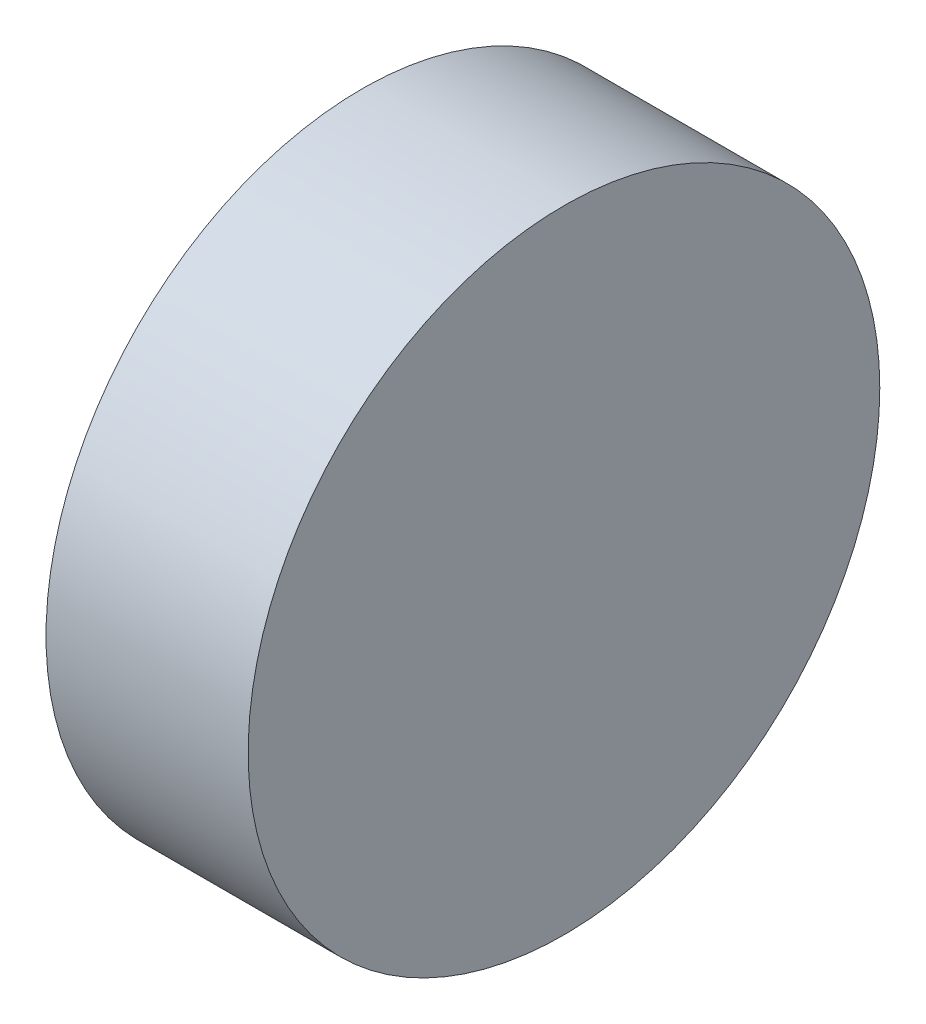
ISO-10303-21;
HEADER;
FILE_DESCRIPTION(('STEP AP214'),'2;1');
FILE_NAME('part.step','',(''),(''),'','','');
FILE_SCHEMA(('AUTOMOTIVE_DESIGN { 1 0 10303 214 1 1 1 1 }'));
ENDSEC;
DATA;
#1=APPLICATION_CONTEXT('core data for automotive mechanical design processes');
#2=APPLICATION_PROTOCOL_DEFINITION('international standard','automotive_design',2000,#1);
#3=PRODUCT_CONTEXT('',#1,'mechanical');
#4=PRODUCT('Part','Part','',(#3));
#5=PRODUCT_RELATED_PRODUCT_CATEGORY('part','',(#4));
#6=PRODUCT_DEFINITION_FORMATION('','',#4);
#7=PRODUCT_DEFINITION_CONTEXT('part definition',#1,'design');
#8=PRODUCT_DEFINITION('design','',#6,#7);
#9=PRODUCT_DEFINITION_SHAPE('','',#8);
#10=(LENGTH_UNIT() NAMED_UNIT(*) SI_UNIT(.MILLI.,.METRE.));
#11=(NAMED_UNIT(*) PLANE_ANGLE_UNIT() SI_UNIT($,.RADIAN.));
#12=(NAMED_UNIT(*) SI_UNIT($,.STERADIAN.) SOLID_ANGLE_UNIT());
#13=UNCERTAINTY_MEASURE_WITH_UNIT(LENGTH_MEASURE(1.E-05),#10,'distance_accuracy_value','');
#14=(GEOMETRIC_REPRESENTATION_CONTEXT(3) GLOBAL_UNCERTAINTY_ASSIGNED_CONTEXT((#13)) GLOBAL_UNIT_ASSIGNED_CONTEXT((#10,
#11,#12)) REPRESENTATION_CONTEXT('',''));
#15=CARTESIAN_POINT('',(0.,0.,0.));
#16=DIRECTION('',(0.,0.,1.));
#17=DIRECTION('',(1.,0.,0.));
#18=AXIS2_PLACEMENT_3D('',#15,#16,#17);
#19=CARTESIAN_POINT('',(203.2,0.,0.));
#20=DIRECTION('',(-1.,0.,0.));
#21=DIRECTION('',(0.,0.,1.));
#22=AXIS2_PLACEMENT_3D('',#19,#20,#21);
#23=CYLINDRICAL_SURFACE('',#22,317.5);
#24=CARTESIAN_POINT('',(203.2,0.,0.));
#25=DIRECTION('',(1.,0.,0.));
#26=DIRECTION('',(0.,0.,-1.));
#27=AXIS2_PLACEMENT_3D('',#24,#25,#26);
#28=CIRCLE('',#27,317.5);
#29=CARTESIAN_POINT('',(203.2,0.,-317.5));
#30=VERTEX_POINT('',#29);
#31=EDGE_CURVE('E10',#30,#30,#28,.T.);
#32=ORIENTED_EDGE('',*,*,#31,.F.);
#33=EDGE_LOOP('',(#32));
#34=FACE_BOUND('',#33,.T.);
#35=CARTESIAN_POINT('',(0.,0.,0.));
#36=DIRECTION('',(1.,0.,0.));
#37=DIRECTION('',(0.,0.,-1.));
#38=AXIS2_PLACEMENT_3D('',#35,#36,#37);
#39=CIRCLE('',#38,317.5);
#40=CARTESIAN_POINT('',(0.,0.,-317.5));
#41=VERTEX_POINT('',#40);
#42=EDGE_CURVE('E39',#41,#41,#39,.T.);
#43=ORIENTED_EDGE('',*,*,#42,.T.);
#44=EDGE_LOOP('',(#43));
#45=FACE_BOUND('',#44,.T.);
#46=ADVANCED_FACE('F36',(#34,#45),#23,.T.);
#47=CARTESIAN_POINT('',(203.2,0.,0.));
#48=DIRECTION('',(1.,0.,0.));
#49=DIRECTION('',(0.,0.,-1.));
#50=AXIS2_PLACEMENT_3D('',#47,#48,#49);
#51=PLANE('',#50);
#52=ORIENTED_EDGE('',*,*,#31,.T.);
#53=EDGE_LOOP('',(#52));
#54=FACE_BOUND('',#53,.T.);
#55=ADVANCED_FACE('F51',(#54),#51,.T.);
#56=CARTESIAN_POINT('',(0.,0.,0.));
#57=DIRECTION('',(1.,0.,0.));
#58=DIRECTION('',(0.,0.,-1.));
#59=AXIS2_PLACEMENT_3D('',#56,#57,#58);
#60=PLANE('',#59);
#61=ORIENTED_EDGE('',*,*,#42,.F.);
#62=EDGE_LOOP('',(#61));
#63=FACE_BOUND('',#62,.T.);
#64=ADVANCED_FACE('F49',(#63),#60,.F.);
#65=CLOSED_SHELL('',(#46,#55,#64));
#66=MANIFOLD_SOLID_BREP('B2',#65);
#67=ADVANCED_BREP_SHAPE_REPRESENTATION('',(#18,#66),#14);
#68=SHAPE_DEFINITION_REPRESENTATION(#9,#67);
ENDSEC;
END-ISO-10303-21;
